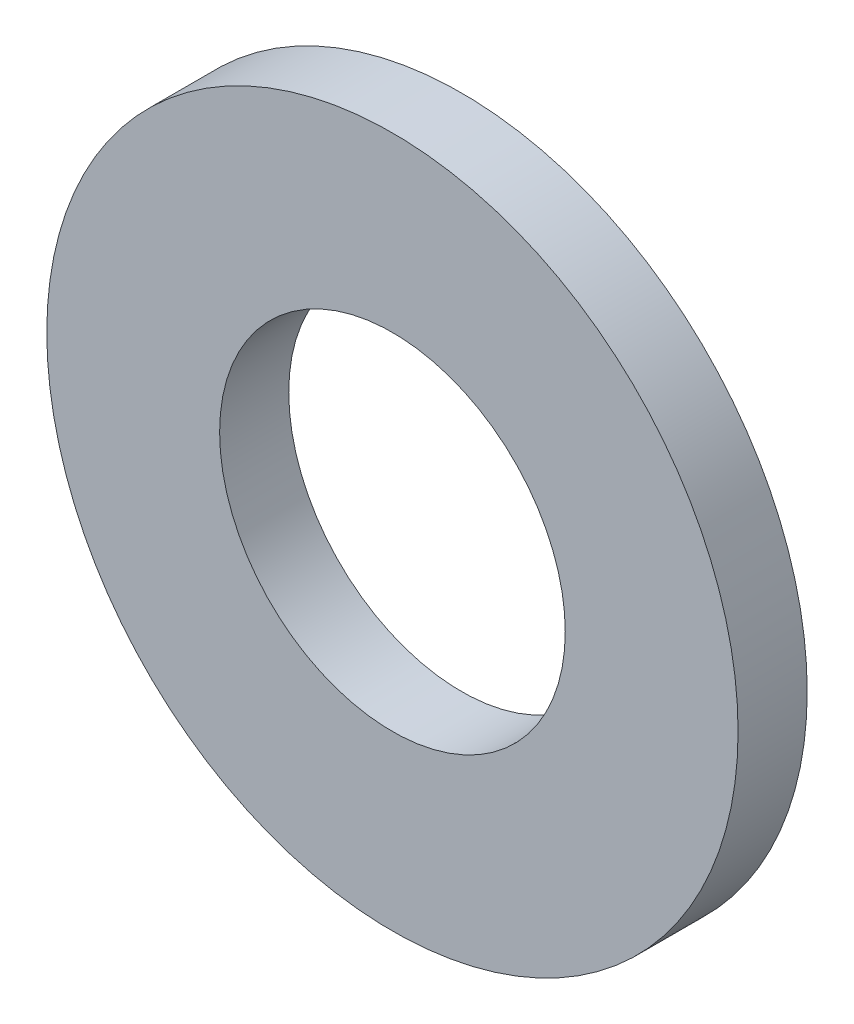
ISO-10303-21;
HEADER;
FILE_DESCRIPTION(('STEP AP214'),'2;1');
FILE_NAME('part.step','',(''),(''),'','','');
FILE_SCHEMA(('AUTOMOTIVE_DESIGN { 1 0 10303 214 1 1 1 1 }'));
ENDSEC;
DATA;
#1=APPLICATION_CONTEXT('core data for automotive mechanical design processes');
#2=APPLICATION_PROTOCOL_DEFINITION('international standard','automotive_design',2000,#1);
#3=PRODUCT_CONTEXT('',#1,'mechanical');
#4=PRODUCT('Part','Part','',(#3));
#5=PRODUCT_RELATED_PRODUCT_CATEGORY('part','',(#4));
#6=PRODUCT_DEFINITION_FORMATION('','',#4);
#7=PRODUCT_DEFINITION_CONTEXT('part definition',#1,'design');
#8=PRODUCT_DEFINITION('design','',#6,#7);
#9=PRODUCT_DEFINITION_SHAPE('','',#8);
#10=(LENGTH_UNIT() NAMED_UNIT(*) SI_UNIT(.MILLI.,.METRE.));
#11=(NAMED_UNIT(*) PLANE_ANGLE_UNIT() SI_UNIT($,.RADIAN.));
#12=(NAMED_UNIT(*) SI_UNIT($,.STERADIAN.) SOLID_ANGLE_UNIT());
#13=UNCERTAINTY_MEASURE_WITH_UNIT(LENGTH_MEASURE(1.E-05),#10,'distance_accuracy_value','');
#14=(GEOMETRIC_REPRESENTATION_CONTEXT(3) GLOBAL_UNCERTAINTY_ASSIGNED_CONTEXT((#13)) GLOBAL_UNIT_ASSIGNED_CONTEXT((#10,
#11,#12)) REPRESENTATION_CONTEXT('',''));
#15=CARTESIAN_POINT('',(0.,0.,0.));
#16=DIRECTION('',(0.,0.,1.));
#17=DIRECTION('',(1.,0.,0.));
#18=AXIS2_PLACEMENT_3D('',#15,#16,#17);
#19=CARTESIAN_POINT('',(0.,0.,0.5));
#20=DIRECTION('',(0.,0.,1.));
#21=DIRECTION('',(1.,0.,0.));
#22=AXIS2_PLACEMENT_3D('',#19,#20,#21);
#23=PLANE('',#22);
#24=CARTESIAN_POINT('',(0.,0.,0.5));
#25=DIRECTION('',(0.,0.,1.));
#26=DIRECTION('',(1.,0.,0.));
#27=AXIS2_PLACEMENT_3D('',#24,#25,#26);
#28=CIRCLE('',#27,2.5);
#29=CARTESIAN_POINT('',(2.5,0.,0.5));
#30=VERTEX_POINT('',#29);
#31=EDGE_CURVE('E10',#30,#30,#28,.T.);
#32=ORIENTED_EDGE('',*,*,#31,.T.);
#33=EDGE_LOOP('',(#32));
#34=FACE_BOUND('',#33,.T.);
#35=CARTESIAN_POINT('',(0.,0.,0.5));
#36=DIRECTION('',(0.,0.,1.));
#37=DIRECTION('',(1.,0.,0.));
#38=AXIS2_PLACEMENT_3D('',#35,#36,#37);
#39=CIRCLE('',#38,1.25);
#40=CARTESIAN_POINT('',(1.25,0.,0.5));
#41=VERTEX_POINT('',#40);
#42=EDGE_CURVE('E58',#41,#41,#39,.T.);
#43=ORIENTED_EDGE('',*,*,#42,.F.);
#44=EDGE_LOOP('',(#43));
#45=FACE_BOUND('',#44,.T.);
#46=ADVANCED_FACE('F45',(#34,#45),#23,.T.);
#47=CARTESIAN_POINT('',(0.,0.,0.));
#48=DIRECTION('',(0.,0.,1.));
#49=DIRECTION('',(1.,0.,0.));
#50=AXIS2_PLACEMENT_3D('',#47,#48,#49);
#51=PLANE('',#50);
#52=CARTESIAN_POINT('',(0.,0.,0.));
#53=DIRECTION('',(0.,0.,1.));
#54=DIRECTION('',(1.,0.,0.));
#55=AXIS2_PLACEMENT_3D('',#52,#53,#54);
#56=CIRCLE('',#55,2.5);
#57=CARTESIAN_POINT('',(2.5,0.,0.));
#58=VERTEX_POINT('',#57);
#59=EDGE_CURVE('E49',#58,#58,#56,.T.);
#60=ORIENTED_EDGE('',*,*,#59,.F.);
#61=EDGE_LOOP('',(#60));
#62=FACE_BOUND('',#61,.T.);
#63=CARTESIAN_POINT('',(0.,0.,0.));
#64=DIRECTION('',(0.,0.,1.));
#65=DIRECTION('',(1.,0.,0.));
#66=AXIS2_PLACEMENT_3D('',#63,#64,#65);
#67=CIRCLE('',#66,1.25);
#68=CARTESIAN_POINT('',(1.25,0.,0.));
#69=VERTEX_POINT('',#68);
#70=EDGE_CURVE('E60',#69,#69,#67,.T.);
#71=ORIENTED_EDGE('',*,*,#70,.T.);
#72=EDGE_LOOP('',(#71));
#73=FACE_BOUND('',#72,.T.);
#74=ADVANCED_FACE('F72',(#62,#73),#51,.F.);
#75=CARTESIAN_POINT('',(0.,0.,0.5));
#76=DIRECTION('',(0.,0.,-1.));
#77=DIRECTION('',(-1.,0.,0.));
#78=AXIS2_PLACEMENT_3D('',#75,#76,#77);
#79=CYLINDRICAL_SURFACE('',#78,2.5);
#80=ORIENTED_EDGE('',*,*,#31,.F.);
#81=EDGE_LOOP('',(#80));
#82=FACE_BOUND('',#81,.T.);
#83=ORIENTED_EDGE('',*,*,#59,.T.);
#84=EDGE_LOOP('',(#83));
#85=FACE_BOUND('',#84,.T.);
#86=ADVANCED_FACE('F47',(#82,#85),#79,.T.);
#87=CARTESIAN_POINT('',(0.,0.,0.5));
#88=DIRECTION('',(0.,0.,-1.));
#89=DIRECTION('',(-1.,0.,0.));
#90=AXIS2_PLACEMENT_3D('',#87,#88,#89);
#91=CYLINDRICAL_SURFACE('',#90,1.25);
#92=ORIENTED_EDGE('',*,*,#42,.T.);
#93=EDGE_LOOP('',(#92));
#94=FACE_BOUND('',#93,.T.);
#95=ORIENTED_EDGE('',*,*,#70,.F.);
#96=EDGE_LOOP('',(#95));
#97=FACE_BOUND('',#96,.T.);
#98=ADVANCED_FACE('F68',(#94,#97),#91,.F.);
#99=CLOSED_SHELL('',(#46,#74,#86,#98));
#100=MANIFOLD_SOLID_BREP('B2',#99);
#101=ADVANCED_BREP_SHAPE_REPRESENTATION('',(#18,#100),#14);
#102=SHAPE_DEFINITION_REPRESENTATION(#9,#101);
ENDSEC;
END-ISO-10303-21;
